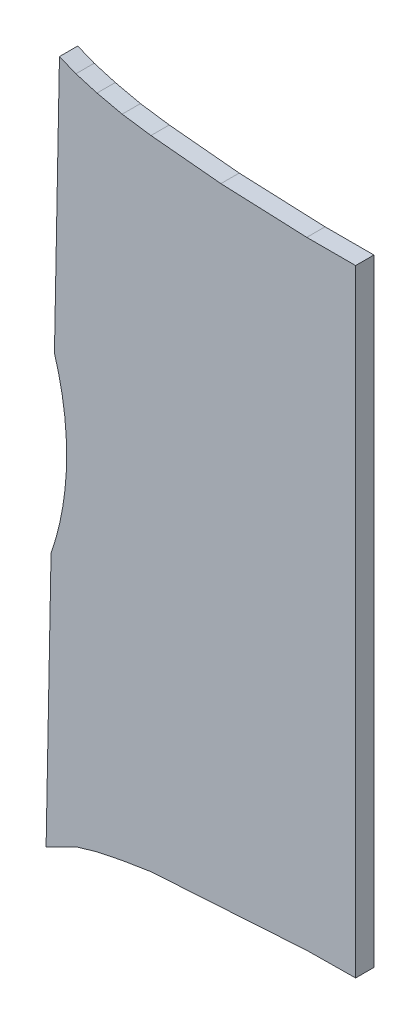
ISO-10303-21;
HEADER;
FILE_DESCRIPTION(('STEP AP214'),'2;1');
FILE_NAME('part.step','',(''),(''),'','','');
FILE_SCHEMA(('AUTOMOTIVE_DESIGN { 1 0 10303 214 1 1 1 1 }'));
ENDSEC;
DATA;
#1=APPLICATION_CONTEXT('core data for automotive mechanical design processes');
#2=APPLICATION_PROTOCOL_DEFINITION('international standard','automotive_design',2000,#1);
#3=PRODUCT_CONTEXT('',#1,'mechanical');
#4=PRODUCT('Part','Part','',(#3));
#5=PRODUCT_RELATED_PRODUCT_CATEGORY('part','',(#4));
#6=PRODUCT_DEFINITION_FORMATION('','',#4);
#7=PRODUCT_DEFINITION_CONTEXT('part definition',#1,'design');
#8=PRODUCT_DEFINITION('design','',#6,#7);
#9=PRODUCT_DEFINITION_SHAPE('','',#8);
#10=(LENGTH_UNIT() NAMED_UNIT(*) SI_UNIT(.MILLI.,.METRE.));
#11=(NAMED_UNIT(*) PLANE_ANGLE_UNIT() SI_UNIT($,.RADIAN.));
#12=(NAMED_UNIT(*) SI_UNIT($,.STERADIAN.) SOLID_ANGLE_UNIT());
#13=UNCERTAINTY_MEASURE_WITH_UNIT(LENGTH_MEASURE(1.E-05),#10,'distance_accuracy_value','');
#14=(GEOMETRIC_REPRESENTATION_CONTEXT(3) GLOBAL_UNCERTAINTY_ASSIGNED_CONTEXT((#13)) GLOBAL_UNIT_ASSIGNED_CONTEXT((#10,
#11,#12)) REPRESENTATION_CONTEXT('',''));
#15=CARTESIAN_POINT('',(0.,0.,0.));
#16=DIRECTION('',(0.,0.,1.));
#17=DIRECTION('',(1.,0.,0.));
#18=AXIS2_PLACEMENT_3D('',#15,#16,#17);
#19=CARTESIAN_POINT('',(80.0120010375977,56.6370010375977,0.));
#20=DIRECTION('',(-1.,0.,0.));
#21=DIRECTION('',(0.,1.,0.));
#22=AXIS2_PLACEMENT_3D('',#19,#20,#21);
#23=PLANE('',#22);
#24=DIRECTION('',(0.,1.,0.));
#25=VECTOR('',#24,1.);
#26=CARTESIAN_POINT('',(80.0120010375977,56.6370010375976,0.03556));
#27=LINE('',#26,#25);
#28=CARTESIAN_POINT('',(80.0120010375977,56.6370010375976,0.03556));
#29=VERTEX_POINT('',#28);
#30=CARTESIAN_POINT('',(80.0120010375977,57.8370018005371,0.03556));
#31=VERTEX_POINT('',#30);
#32=EDGE_CURVE('E11',#29,#31,#27,.T.);
#33=ORIENTED_EDGE('',*,*,#32,.F.);
#34=DIRECTION('',(0.,0.,1.));
#35=VECTOR('',#34,1.);
#36=CARTESIAN_POINT('',(80.0120010375977,56.6370010375976,0.));
#37=LINE('',#36,#35);
#38=CARTESIAN_POINT('',(80.0120010375977,56.6370010375976,0.));
#39=VERTEX_POINT('',#38);
#40=EDGE_CURVE('E24',#39,#29,#37,.T.);
#41=ORIENTED_EDGE('',*,*,#40,.F.);
#42=DIRECTION('',(0.,1.,0.));
#43=VECTOR('',#42,1.);
#44=CARTESIAN_POINT('',(80.0120010375977,56.6370010375976,0.));
#45=LINE('',#44,#43);
#46=CARTESIAN_POINT('',(80.0120010375977,57.8370018005371,0.));
#47=VERTEX_POINT('',#46);
#48=EDGE_CURVE('E281',#39,#47,#45,.T.);
#49=ORIENTED_EDGE('',*,*,#48,.T.);
#50=DIRECTION('',(0.,0.,1.));
#51=VECTOR('',#50,1.);
#52=CARTESIAN_POINT('',(80.0120010375977,57.8370018005371,0.));
#53=LINE('',#52,#51);
#54=EDGE_CURVE('E37',#47,#31,#53,.T.);
#55=ORIENTED_EDGE('',*,*,#54,.T.);
#56=EDGE_LOOP('',(#33,#41,#49,#55));
#57=FACE_BOUND('',#56,.T.);
#58=ADVANCED_FACE('F17',(#57),#23,.F.);
#59=CARTESIAN_POINT('',(79.9169998168945,56.6360015869141,0.));
#60=DIRECTION('',(-0.010519816185477,0.999944665202742,0.));
#61=DIRECTION('',(0.999944665202742,0.010519816185477,0.));
#62=AXIS2_PLACEMENT_3D('',#59,#60,#61);
#63=PLANE('',#62);
#64=DIRECTION('',(0.999944665202742,0.010519816185477,0.));
#65=VECTOR('',#64,1.);
#66=CARTESIAN_POINT('',(79.9169998168945,56.6360015869141,0.03556));
#67=LINE('',#66,#65);
#68=CARTESIAN_POINT('',(79.9169998168945,56.6360015869141,0.03556));
#69=VERTEX_POINT('',#68);
#70=EDGE_CURVE('E277',#69,#29,#67,.T.);
#71=ORIENTED_EDGE('',*,*,#70,.F.);
#72=DIRECTION('',(0.,0.,1.));
#73=VECTOR('',#72,1.);
#74=CARTESIAN_POINT('',(79.9169998168945,56.6360015869141,0.));
#75=LINE('',#74,#73);
#76=CARTESIAN_POINT('',(79.9169998168945,56.6360015869141,0.));
#77=VERTEX_POINT('',#76);
#78=EDGE_CURVE('E275',#77,#69,#75,.T.);
#79=ORIENTED_EDGE('',*,*,#78,.F.);
#80=DIRECTION('',(0.999944665202742,0.010519816185477,0.));
#81=VECTOR('',#80,1.);
#82=CARTESIAN_POINT('',(79.9169998168945,56.6360015869141,0.));
#83=LINE('',#82,#81);
#84=EDGE_CURVE('E273',#77,#39,#83,.T.);
#85=ORIENTED_EDGE('',*,*,#84,.T.);
#86=ORIENTED_EDGE('',*,*,#40,.T.);
#87=EDGE_LOOP('',(#71,#79,#85,#86));
#88=FACE_BOUND('',#87,.T.);
#89=ADVANCED_FACE('F284',(#88),#63,.F.);
#90=CARTESIAN_POINT('',(79.613998413086,56.617000579834,0.));
#91=DIRECTION('',(-0.0625863654447241,0.998039551751542,0.));
#92=DIRECTION('',(0.998039551751542,0.0625863654447241,0.));
#93=AXIS2_PLACEMENT_3D('',#90,#91,#92);
#94=PLANE('',#93);
#95=DIRECTION('',(0.998039551751542,0.062586365444724,0.));
#96=VECTOR('',#95,1.);
#97=CARTESIAN_POINT('',(79.6139984130859,56.617000579834,0.03556));
#98=LINE('',#97,#96);
#99=CARTESIAN_POINT('',(79.6139984130859,56.617000579834,0.03556));
#100=VERTEX_POINT('',#99);
#101=EDGE_CURVE('E270',#100,#69,#98,.T.);
#102=ORIENTED_EDGE('',*,*,#101,.F.);
#103=DIRECTION('',(0.,0.,1.));
#104=VECTOR('',#103,1.);
#105=CARTESIAN_POINT('',(79.6139984130859,56.617000579834,0.));
#106=LINE('',#105,#104);
#107=CARTESIAN_POINT('',(79.6139984130859,56.617000579834,0.));
#108=VERTEX_POINT('',#107);
#109=EDGE_CURVE('E268',#108,#100,#106,.T.);
#110=ORIENTED_EDGE('',*,*,#109,.F.);
#111=DIRECTION('',(0.998039551751542,0.062586365444724,0.));
#112=VECTOR('',#111,1.);
#113=CARTESIAN_POINT('',(79.6139984130859,56.617000579834,0.));
#114=LINE('',#113,#112);
#115=EDGE_CURVE('E265',#108,#77,#114,.T.);
#116=ORIENTED_EDGE('',*,*,#115,.T.);
#117=ORIENTED_EDGE('',*,*,#78,.T.);
#118=EDGE_LOOP('',(#102,#110,#116,#117));
#119=FACE_BOUND('',#118,.T.);
#120=ADVANCED_FACE('F287',(#119),#94,.F.);
#121=CARTESIAN_POINT('',(79.5579986572266,56.6080017089844,0.));
#122=DIRECTION('',(-0.158659362899509,0.98733338167223,0.));
#123=DIRECTION('',(0.98733338167223,0.158659362899509,0.));
#124=AXIS2_PLACEMENT_3D('',#121,#122,#123);
#125=PLANE('',#124);
#126=DIRECTION('',(0.98733338167223,0.158659362899509,0.));
#127=VECTOR('',#126,1.);
#128=CARTESIAN_POINT('',(79.5579986572266,56.6080017089844,0.03556));
#129=LINE('',#128,#127);
#130=CARTESIAN_POINT('',(79.5579986572266,56.6080017089844,0.03556));
#131=VERTEX_POINT('',#130);
#132=EDGE_CURVE('E262',#131,#100,#129,.T.);
#133=ORIENTED_EDGE('',*,*,#132,.F.);
#134=DIRECTION('',(0.,0.,1.));
#135=VECTOR('',#134,1.);
#136=CARTESIAN_POINT('',(79.5579986572266,56.6080017089844,0.));
#137=LINE('',#136,#135);
#138=CARTESIAN_POINT('',(79.5579986572266,56.6080017089844,0.));
#139=VERTEX_POINT('',#138);
#140=EDGE_CURVE('E260',#139,#131,#137,.T.);
#141=ORIENTED_EDGE('',*,*,#140,.F.);
#142=DIRECTION('',(0.98733338167223,0.158659362899509,0.));
#143=VECTOR('',#142,1.);
#144=CARTESIAN_POINT('',(79.5579986572266,56.6080017089844,0.));
#145=LINE('',#144,#143);
#146=EDGE_CURVE('E257',#139,#108,#145,.T.);
#147=ORIENTED_EDGE('',*,*,#146,.T.);
#148=ORIENTED_EDGE('',*,*,#109,.T.);
#149=EDGE_LOOP('',(#133,#141,#147,#148));
#150=FACE_BOUND('',#149,.T.);
#151=ADVANCED_FACE('F292',(#150),#125,.F.);
#152=CARTESIAN_POINT('',(79.5090026855469,56.5979995727539,0.));
#153=DIRECTION('',(-0.200016805310508,0.979792466593502,0.));
#154=DIRECTION('',(0.979792466593502,0.200016805310508,0.));
#155=AXIS2_PLACEMENT_3D('',#152,#153,#154);
#156=PLANE('',#155);
#157=DIRECTION('',(0.979792466593502,0.200016805310508,0.));
#158=VECTOR('',#157,1.);
#159=CARTESIAN_POINT('',(79.5090026855469,56.5979995727539,0.03556));
#160=LINE('',#159,#158);
#161=CARTESIAN_POINT('',(79.5090026855469,56.5979995727539,0.03556));
#162=VERTEX_POINT('',#161);
#163=EDGE_CURVE('E254',#162,#131,#160,.T.);
#164=ORIENTED_EDGE('',*,*,#163,.F.);
#165=DIRECTION('',(0.,0.,1.));
#166=VECTOR('',#165,1.);
#167=CARTESIAN_POINT('',(79.5090026855469,56.5979995727539,0.));
#168=LINE('',#167,#166);
#169=CARTESIAN_POINT('',(79.5090026855469,56.5979995727539,0.));
#170=VERTEX_POINT('',#169);
#171=EDGE_CURVE('E252',#170,#162,#168,.T.);
#172=ORIENTED_EDGE('',*,*,#171,.F.);
#173=DIRECTION('',(0.979792466593502,0.200016805310508,0.));
#174=VECTOR('',#173,1.);
#175=CARTESIAN_POINT('',(79.5090026855469,56.5979995727539,0.));
#176=LINE('',#175,#174);
#177=EDGE_CURVE('E249',#170,#139,#176,.T.);
#178=ORIENTED_EDGE('',*,*,#177,.T.);
#179=ORIENTED_EDGE('',*,*,#140,.T.);
#180=EDGE_LOOP('',(#164,#172,#178,#179));
#181=FACE_BOUND('',#180,.T.);
#182=ADVANCED_FACE('F295',(#181),#156,.F.);
#183=CARTESIAN_POINT('',(79.4680023193359,56.5859985351562,0.));
#184=DIRECTION('',(-0.280918813771343,0.959731535414619,0.));
#185=DIRECTION('',(0.959731535414619,0.280918813771343,0.));
#186=AXIS2_PLACEMENT_3D('',#183,#184,#185);
#187=PLANE('',#186);
#188=DIRECTION('',(0.959731535414619,0.280918813771343,0.));
#189=VECTOR('',#188,1.);
#190=CARTESIAN_POINT('',(79.4680023193359,56.5859985351562,0.03556));
#191=LINE('',#190,#189);
#192=CARTESIAN_POINT('',(79.4680023193359,56.5859985351562,0.03556));
#193=VERTEX_POINT('',#192);
#194=EDGE_CURVE('E246',#193,#162,#191,.T.);
#195=ORIENTED_EDGE('',*,*,#194,.F.);
#196=DIRECTION('',(0.,0.,1.));
#197=VECTOR('',#196,1.);
#198=CARTESIAN_POINT('',(79.4680023193359,56.5859985351562,0.));
#199=LINE('',#198,#197);
#200=CARTESIAN_POINT('',(79.4680023193359,56.5859985351562,0.));
#201=VERTEX_POINT('',#200);
#202=EDGE_CURVE('E244',#201,#193,#199,.T.);
#203=ORIENTED_EDGE('',*,*,#202,.F.);
#204=DIRECTION('',(0.959731535414619,0.280918813771343,0.));
#205=VECTOR('',#204,1.);
#206=CARTESIAN_POINT('',(79.4680023193359,56.5859985351562,0.));
#207=LINE('',#206,#205);
#208=EDGE_CURVE('E241',#201,#170,#207,.T.);
#209=ORIENTED_EDGE('',*,*,#208,.T.);
#210=ORIENTED_EDGE('',*,*,#171,.T.);
#211=EDGE_LOOP('',(#195,#203,#209,#210));
#212=FACE_BOUND('',#211,.T.);
#213=ADVANCED_FACE('F300',(#212),#187,.F.);
#214=CARTESIAN_POINT('',(79.4100036621094,56.556999206543,0.));
#215=DIRECTION('',(-0.447213595499958,0.894427190999916,0.));
#216=DIRECTION('',(0.894427190999916,0.447213595499958,0.));
#217=AXIS2_PLACEMENT_3D('',#214,#215,#216);
#218=PLANE('',#217);
#219=DIRECTION('',(0.894427190999916,0.447213595499958,0.));
#220=VECTOR('',#219,1.);
#221=CARTESIAN_POINT('',(79.4100036621094,56.556999206543,0.03556));
#222=LINE('',#221,#220);
#223=CARTESIAN_POINT('',(79.4100036621094,56.556999206543,0.03556));
#224=VERTEX_POINT('',#223);
#225=EDGE_CURVE('E238',#224,#193,#222,.T.);
#226=ORIENTED_EDGE('',*,*,#225,.F.);
#227=DIRECTION('',(0.,0.,1.));
#228=VECTOR('',#227,1.);
#229=CARTESIAN_POINT('',(79.4100036621094,56.556999206543,0.));
#230=LINE('',#229,#228);
#231=CARTESIAN_POINT('',(79.4100036621094,56.556999206543,0.));
#232=VERTEX_POINT('',#231);
#233=EDGE_CURVE('E236',#232,#224,#230,.T.);
#234=ORIENTED_EDGE('',*,*,#233,.F.);
#235=DIRECTION('',(0.894427190999916,0.447213595499958,0.));
#236=VECTOR('',#235,1.);
#237=CARTESIAN_POINT('',(79.4100036621094,56.556999206543,0.));
#238=LINE('',#237,#236);
#239=EDGE_CURVE('E233',#232,#201,#238,.T.);
#240=ORIENTED_EDGE('',*,*,#239,.T.);
#241=ORIENTED_EDGE('',*,*,#202,.T.);
#242=EDGE_LOOP('',(#226,#234,#240,#241));
#243=FACE_BOUND('',#242,.T.);
#244=ADVANCED_FACE('F303',(#243),#218,.F.);
#245=CARTESIAN_POINT('',(79.4196636040974,57.0564723619736,0.));
#246=DIRECTION('',(0.999813029571255,-0.0193366465434987,0.));
#247=DIRECTION('',(-0.0193366465434987,-0.999813029571255,0.));
#248=AXIS2_PLACEMENT_3D('',#245,#246,#247);
#249=PLANE('',#248);
#250=DIRECTION('',(-0.0193366465434987,-0.999813029571255,0.));
#251=VECTOR('',#250,1.);
#252=CARTESIAN_POINT('',(79.4359970092773,57.9010009765625,0.03556));
#253=LINE('',#252,#251);
#254=CARTESIAN_POINT('',(79.4196636040974,57.0564723619736,0.03556));
#255=VERTEX_POINT('',#254);
#256=EDGE_CURVE('E230',#255,#224,#253,.T.);
#257=ORIENTED_EDGE('',*,*,#256,.F.);
#258=DIRECTION('',(0.,0.,1.));
#259=VECTOR('',#258,1.);
#260=CARTESIAN_POINT('',(79.4196636040974,57.0564723619736,0.));
#261=LINE('',#260,#259);
#262=CARTESIAN_POINT('',(79.4196636040974,57.0564723619736,0.));
#263=VERTEX_POINT('',#262);
#264=EDGE_CURVE('E228',#263,#255,#261,.T.);
#265=ORIENTED_EDGE('',*,*,#264,.F.);
#266=DIRECTION('',(-0.0193366465434987,-0.999813029571255,0.));
#267=VECTOR('',#266,1.);
#268=CARTESIAN_POINT('',(79.4359970092773,57.9010009765625,0.));
#269=LINE('',#268,#267);
#270=EDGE_CURVE('E225',#263,#232,#269,.T.);
#271=ORIENTED_EDGE('',*,*,#270,.T.);
#272=ORIENTED_EDGE('',*,*,#233,.T.);
#273=EDGE_LOOP('',(#257,#265,#271,#272));
#274=FACE_BOUND('',#273,.T.);
#275=ADVANCED_FACE('F308',(#274),#249,.F.);
#276=CARTESIAN_POINT('',(78.90002,57.2366648,0.));
#277=DIRECTION('',(0.,0.,-1.));
#278=DIRECTION('',(1.,0.,0.));
#279=AXIS2_PLACEMENT_3D('',#276,#277,#278);
#280=CYLINDRICAL_SURFACE('',#279,0.5499989);
#281=ORIENTED_EDGE('',*,*,#264,.T.);
#282=CARTESIAN_POINT('',(78.90002,57.2366648,0.03556));
#283=DIRECTION('',(0.,0.,1.));
#284=DIRECTION('',(1.,0.,0.));
#285=AXIS2_PLACEMENT_3D('',#282,#283,#284);
#286=CIRCLE('',#285,0.5499989);
#287=CARTESIAN_POINT('',(79.4500189,57.2366648,0.03556));
#288=VERTEX_POINT('',#287);
#289=EDGE_CURVE('E222',#255,#288,#286,.T.);
#290=ORIENTED_EDGE('',*,*,#289,.T.);
#291=DIRECTION('',(0.,0.,1.));
#292=VECTOR('',#291,1.);
#293=CARTESIAN_POINT('',(79.4500189,57.2366648,0.));
#294=LINE('',#293,#292);
#295=CARTESIAN_POINT('',(79.4500189,57.2366648,0.));
#296=VERTEX_POINT('',#295);
#297=EDGE_CURVE('E220',#296,#288,#294,.T.);
#298=ORIENTED_EDGE('',*,*,#297,.F.);
#299=CARTESIAN_POINT('',(78.90002,57.2366648,0.));
#300=DIRECTION('',(0.,0.,1.));
#301=DIRECTION('',(1.,0.,0.));
#302=AXIS2_PLACEMENT_3D('',#299,#300,#301);
#303=CIRCLE('',#302,0.5499989);
#304=EDGE_CURVE('E217',#263,#296,#303,.T.);
#305=ORIENTED_EDGE('',*,*,#304,.F.);
#306=EDGE_LOOP('',(#281,#290,#298,#305));
#307=FACE_BOUND('',#306,.T.);
#308=ADVANCED_FACE('F311',(#307),#280,.F.);
#309=CARTESIAN_POINT('',(78.90002,57.2366648,0.));
#310=DIRECTION('',(0.,0.,-1.));
#311=DIRECTION('',(1.,0.,0.));
#312=AXIS2_PLACEMENT_3D('',#309,#310,#311);
#313=CYLINDRICAL_SURFACE('',#312,0.5499989);
#314=ORIENTED_EDGE('',*,*,#297,.T.);
#315=CARTESIAN_POINT('',(78.90002,57.2366648,0.03556));
#316=DIRECTION('',(0.,0.,1.));
#317=DIRECTION('',(1.,0.,0.));
#318=AXIS2_PLACEMENT_3D('',#315,#316,#317);
#319=CIRCLE('',#318,0.5499989);
#320=CARTESIAN_POINT('',(79.4262423405181,57.3966299160124,0.03556));
#321=VERTEX_POINT('',#320);
#322=EDGE_CURVE('E214',#288,#321,#319,.T.);
#323=ORIENTED_EDGE('',*,*,#322,.T.);
#324=DIRECTION('',(0.,0.,1.));
#325=VECTOR('',#324,1.);
#326=CARTESIAN_POINT('',(79.4262423405181,57.3966299160124,0.));
#327=LINE('',#326,#325);
#328=CARTESIAN_POINT('',(79.4262423405181,57.3966299160124,0.));
#329=VERTEX_POINT('',#328);
#330=EDGE_CURVE('E212',#329,#321,#327,.T.);
#331=ORIENTED_EDGE('',*,*,#330,.F.);
#332=EDGE_CURVE('E211',#296,#329,#303,.T.);
#333=ORIENTED_EDGE('',*,*,#332,.F.);
#334=EDGE_LOOP('',(#314,#323,#331,#333));
#335=FACE_BOUND('',#334,.T.);
#336=ADVANCED_FACE('F318',(#335),#313,.F.);
#337=CARTESIAN_POINT('',(79.4359970092774,57.9010009765625,0.));
#338=DIRECTION('',(0.999813029571255,-0.0193366465434987,0.));
#339=DIRECTION('',(-0.0193366465434987,-0.999813029571255,0.));
#340=AXIS2_PLACEMENT_3D('',#337,#338,#339);
#341=PLANE('',#340);
#342=DIRECTION('',(-0.0193366465434987,-0.999813029571255,0.));
#343=VECTOR('',#342,1.);
#344=CARTESIAN_POINT('',(79.4359970092773,57.9010009765625,0.03556));
#345=LINE('',#344,#343);
#346=CARTESIAN_POINT('',(79.4359970092773,57.9010009765625,0.03556));
#347=VERTEX_POINT('',#346);
#348=EDGE_CURVE('E208',#347,#321,#345,.T.);
#349=ORIENTED_EDGE('',*,*,#348,.F.);
#350=DIRECTION('',(0.,0.,1.));
#351=VECTOR('',#350,1.);
#352=CARTESIAN_POINT('',(79.4359970092773,57.9010009765625,0.));
#353=LINE('',#352,#351);
#354=CARTESIAN_POINT('',(79.4359970092773,57.9010009765625,0.));
#355=VERTEX_POINT('',#354);
#356=EDGE_CURVE('E206',#355,#347,#353,.T.);
#357=ORIENTED_EDGE('',*,*,#356,.F.);
#358=EDGE_CURVE('E205',#355,#329,#269,.T.);
#359=ORIENTED_EDGE('',*,*,#358,.T.);
#360=ORIENTED_EDGE('',*,*,#330,.T.);
#361=EDGE_LOOP('',(#349,#357,#359,#360));
#362=FACE_BOUND('',#361,.T.);
#363=ADVANCED_FACE('F321',(#362),#341,.F.);
#364=CARTESIAN_POINT('',(79.4680023193359,57.8880004882812,0.));
#365=DIRECTION('',(-0.376335578562442,-0.926483422575964,0.));
#366=DIRECTION('',(-0.926483422575964,0.376335578562442,0.));
#367=AXIS2_PLACEMENT_3D('',#364,#365,#366);
#368=PLANE('',#367);
#369=DIRECTION('',(-0.926483422575964,0.376335578562442,0.));
#370=VECTOR('',#369,1.);
#371=CARTESIAN_POINT('',(79.4680023193359,57.8880004882812,0.03556));
#372=LINE('',#371,#370);
#373=CARTESIAN_POINT('',(79.4680023193359,57.8880004882812,0.03556));
#374=VERTEX_POINT('',#373);
#375=EDGE_CURVE('E202',#374,#347,#372,.T.);
#376=ORIENTED_EDGE('',*,*,#375,.F.);
#377=DIRECTION('',(0.,0.,1.));
#378=VECTOR('',#377,1.);
#379=CARTESIAN_POINT('',(79.4680023193359,57.8880004882812,0.));
#380=LINE('',#379,#378);
#381=CARTESIAN_POINT('',(79.4680023193359,57.8880004882812,0.));
#382=VERTEX_POINT('',#381);
#383=EDGE_CURVE('E200',#382,#374,#380,.T.);
#384=ORIENTED_EDGE('',*,*,#383,.F.);
#385=DIRECTION('',(-0.926483422575964,0.376335578562442,0.));
#386=VECTOR('',#385,1.);
#387=CARTESIAN_POINT('',(79.4680023193359,57.8880004882812,0.));
#388=LINE('',#387,#386);
#389=EDGE_CURVE('E197',#382,#355,#388,.T.);
#390=ORIENTED_EDGE('',*,*,#389,.T.);
#391=ORIENTED_EDGE('',*,*,#356,.T.);
#392=EDGE_LOOP('',(#376,#384,#390,#391));
#393=FACE_BOUND('',#392,.T.);
#394=ADVANCED_FACE('F326',(#393),#368,.F.);
#395=CARTESIAN_POINT('',(79.5090026855469,57.8759994506836,0.));
#396=DIRECTION('',(-0.280918813771343,-0.959731535414619,0.));
#397=DIRECTION('',(-0.959731535414619,0.280918813771343,0.));
#398=AXIS2_PLACEMENT_3D('',#395,#396,#397);
#399=PLANE('',#398);
#400=DIRECTION('',(-0.959731535414619,0.280918813771343,0.));
#401=VECTOR('',#400,1.);
#402=CARTESIAN_POINT('',(79.5090026855469,57.8759994506836,0.03556));
#403=LINE('',#402,#401);
#404=CARTESIAN_POINT('',(79.5090026855469,57.8759994506836,0.03556));
#405=VERTEX_POINT('',#404);
#406=EDGE_CURVE('E194',#405,#374,#403,.T.);
#407=ORIENTED_EDGE('',*,*,#406,.F.);
#408=DIRECTION('',(0.,0.,1.));
#409=VECTOR('',#408,1.);
#410=CARTESIAN_POINT('',(79.5090026855469,57.8759994506836,0.));
#411=LINE('',#410,#409);
#412=CARTESIAN_POINT('',(79.5090026855469,57.8759994506836,0.));
#413=VERTEX_POINT('',#412);
#414=EDGE_CURVE('E192',#413,#405,#411,.T.);
#415=ORIENTED_EDGE('',*,*,#414,.F.);
#416=DIRECTION('',(-0.959731535414619,0.280918813771343,0.));
#417=VECTOR('',#416,1.);
#418=CARTESIAN_POINT('',(79.5090026855469,57.8759994506836,0.));
#419=LINE('',#418,#417);
#420=EDGE_CURVE('E189',#413,#382,#419,.T.);
#421=ORIENTED_EDGE('',*,*,#420,.T.);
#422=ORIENTED_EDGE('',*,*,#383,.T.);
#423=EDGE_LOOP('',(#407,#415,#421,#422));
#424=FACE_BOUND('',#423,.T.);
#425=ADVANCED_FACE('F329',(#424),#399,.F.);
#426=CARTESIAN_POINT('',(79.5579986572266,57.8650016784668,0.));
#427=DIRECTION('',(-0.219013250789558,-0.975721884544254,0.));
#428=DIRECTION('',(-0.975721884544254,0.219013250789558,0.));
#429=AXIS2_PLACEMENT_3D('',#426,#427,#428);
#430=PLANE('',#429);
#431=DIRECTION('',(-0.975721884544254,0.219013250789558,0.));
#432=VECTOR('',#431,1.);
#433=CARTESIAN_POINT('',(79.5579986572266,57.8650016784668,0.03556));
#434=LINE('',#433,#432);
#435=CARTESIAN_POINT('',(79.5579986572266,57.8650016784668,0.03556));
#436=VERTEX_POINT('',#435);
#437=EDGE_CURVE('E186',#436,#405,#434,.T.);
#438=ORIENTED_EDGE('',*,*,#437,.F.);
#439=DIRECTION('',(0.,0.,1.));
#440=VECTOR('',#439,1.);
#441=CARTESIAN_POINT('',(79.5579986572266,57.8650016784668,0.));
#442=LINE('',#441,#440);
#443=CARTESIAN_POINT('',(79.5579986572266,57.8650016784668,0.));
#444=VERTEX_POINT('',#443);
#445=EDGE_CURVE('E184',#444,#436,#442,.T.);
#446=ORIENTED_EDGE('',*,*,#445,.F.);
#447=DIRECTION('',(-0.975721884544254,0.219013250789558,0.));
#448=VECTOR('',#447,1.);
#449=CARTESIAN_POINT('',(79.5579986572266,57.8650016784668,0.));
#450=LINE('',#449,#448);
#451=EDGE_CURVE('E181',#444,#413,#450,.T.);
#452=ORIENTED_EDGE('',*,*,#451,.T.);
#453=ORIENTED_EDGE('',*,*,#414,.T.);
#454=EDGE_LOOP('',(#438,#446,#452,#453));
#455=FACE_BOUND('',#454,.T.);
#456=ADVANCED_FACE('F333',(#455),#430,.F.);
#457=CARTESIAN_POINT('',(79.613998413086,57.8569984436035,0.));
#458=DIRECTION('',(-0.141478001154013,-0.98994139987651,0.));
#459=DIRECTION('',(-0.98994139987651,0.141478001154013,0.));
#460=AXIS2_PLACEMENT_3D('',#457,#458,#459);
#461=PLANE('',#460);
#462=DIRECTION('',(-0.98994139987651,0.141478001154013,0.));
#463=VECTOR('',#462,1.);
#464=CARTESIAN_POINT('',(79.6139984130859,57.8569984436035,0.03556));
#465=LINE('',#464,#463);
#466=CARTESIAN_POINT('',(79.6139984130859,57.8569984436035,0.03556));
#467=VERTEX_POINT('',#466);
#468=EDGE_CURVE('E178',#467,#436,#465,.T.);
#469=ORIENTED_EDGE('',*,*,#468,.F.);
#470=DIRECTION('',(0.,0.,1.));
#471=VECTOR('',#470,1.);
#472=CARTESIAN_POINT('',(79.6139984130859,57.8569984436035,0.));
#473=LINE('',#472,#471);
#474=CARTESIAN_POINT('',(79.6139984130859,57.8569984436035,0.));
#475=VERTEX_POINT('',#474);
#476=EDGE_CURVE('E176',#475,#467,#473,.T.);
#477=ORIENTED_EDGE('',*,*,#476,.F.);
#478=DIRECTION('',(-0.98994139987651,0.141478001154013,0.));
#479=VECTOR('',#478,1.);
#480=CARTESIAN_POINT('',(79.6139984130859,57.8569984436035,0.));
#481=LINE('',#480,#479);
#482=EDGE_CURVE('E173',#475,#444,#481,.T.);
#483=ORIENTED_EDGE('',*,*,#482,.T.);
#484=ORIENTED_EDGE('',*,*,#445,.T.);
#485=EDGE_LOOP('',(#469,#477,#483,#484));
#486=FACE_BOUND('',#485,.T.);
#487=ADVANCED_FACE('F336',(#486),#461,.F.);
#488=CARTESIAN_POINT('',(79.75,57.8440017700195,0.));
#489=DIRECTION('',(-0.095129277619608,-0.995464926825437,0.));
#490=DIRECTION('',(-0.995464926825437,0.095129277619608,0.));
#491=AXIS2_PLACEMENT_3D('',#488,#489,#490);
#492=PLANE('',#491);
#493=DIRECTION('',(-0.995464926825436,0.0951292776196079,0.));
#494=VECTOR('',#493,1.);
#495=CARTESIAN_POINT('',(79.75,57.8440017700195,0.03556));
#496=LINE('',#495,#494);
#497=CARTESIAN_POINT('',(79.75,57.8440017700195,0.03556));
#498=VERTEX_POINT('',#497);
#499=EDGE_CURVE('E170',#498,#467,#496,.T.);
#500=ORIENTED_EDGE('',*,*,#499,.F.);
#501=DIRECTION('',(0.,0.,1.));
#502=VECTOR('',#501,1.);
#503=CARTESIAN_POINT('',(79.75,57.8440017700195,0.));
#504=LINE('',#503,#502);
#505=CARTESIAN_POINT('',(79.75,57.8440017700195,0.));
#506=VERTEX_POINT('',#505);
#507=EDGE_CURVE('E168',#506,#498,#504,.T.);
#508=ORIENTED_EDGE('',*,*,#507,.F.);
#509=DIRECTION('',(-0.995464926825436,0.0951292776196079,0.));
#510=VECTOR('',#509,1.);
#511=CARTESIAN_POINT('',(79.75,57.8440017700195,0.));
#512=LINE('',#511,#510);
#513=EDGE_CURVE('E159',#506,#475,#512,.T.);
#514=ORIENTED_EDGE('',*,*,#513,.T.);
#515=ORIENTED_EDGE('',*,*,#476,.T.);
#516=EDGE_LOOP('',(#500,#508,#514,#515));
#517=FACE_BOUND('',#516,.T.);
#518=ADVANCED_FACE('F339',(#517),#492,.F.);
#519=CARTESIAN_POINT('',(79.9169998168945,57.8370018005371,0.));
#520=DIRECTION('',(-0.0418792570717929,-0.999122679067548,0.));
#521=DIRECTION('',(-0.999122679067548,0.0418792570717929,0.));
#522=AXIS2_PLACEMENT_3D('',#519,#520,#521);
#523=PLANE('',#522);
#524=DIRECTION('',(-0.999122679067548,0.0418792570717929,0.));
#525=VECTOR('',#524,1.);
#526=CARTESIAN_POINT('',(79.9169998168945,57.8370018005371,0.03556));
#527=LINE('',#526,#525);
#528=CARTESIAN_POINT('',(79.9169998168945,57.8370018005371,0.03556));
#529=VERTEX_POINT('',#528);
#530=EDGE_CURVE('E145',#529,#498,#527,.T.);
#531=ORIENTED_EDGE('',*,*,#530,.F.);
#532=DIRECTION('',(0.,0.,1.));
#533=VECTOR('',#532,1.);
#534=CARTESIAN_POINT('',(79.9169998168945,57.8370018005371,0.));
#535=LINE('',#534,#533);
#536=CARTESIAN_POINT('',(79.9169998168945,57.8370018005371,0.));
#537=VERTEX_POINT('',#536);
#538=EDGE_CURVE('E140',#537,#529,#535,.T.);
#539=ORIENTED_EDGE('',*,*,#538,.F.);
#540=DIRECTION('',(-0.999122679067548,0.0418792570717929,0.));
#541=VECTOR('',#540,1.);
#542=CARTESIAN_POINT('',(79.9169998168945,57.8370018005371,0.));
#543=LINE('',#542,#541);
#544=EDGE_CURVE('E143',#537,#506,#543,.T.);
#545=ORIENTED_EDGE('',*,*,#544,.T.);
#546=ORIENTED_EDGE('',*,*,#507,.T.);
#547=EDGE_LOOP('',(#531,#539,#545,#546));
#548=FACE_BOUND('',#547,.T.);
#549=ADVANCED_FACE('F142',(#548),#523,.F.);
#550=CARTESIAN_POINT('',(80.0120010375977,57.8370018005371,0.));
#551=DIRECTION('',(0.,-1.,0.));
#552=DIRECTION('',(-1.,0.,0.));
#553=AXIS2_PLACEMENT_3D('',#550,#551,#552);
#554=PLANE('',#553);
#555=DIRECTION('',(-1.,0.,0.));
#556=VECTOR('',#555,1.);
#557=CARTESIAN_POINT('',(80.0120010375977,57.8370018005371,0.03556));
#558=LINE('',#557,#556);
#559=EDGE_CURVE('E160',#31,#529,#558,.T.);
#560=ORIENTED_EDGE('',*,*,#559,.F.);
#561=ORIENTED_EDGE('',*,*,#54,.F.);
#562=DIRECTION('',(-1.,0.,0.));
#563=VECTOR('',#562,1.);
#564=CARTESIAN_POINT('',(80.0120010375977,57.8370018005371,0.));
#565=LINE('',#564,#563);
#566=EDGE_CURVE('E156',#47,#537,#565,.T.);
#567=ORIENTED_EDGE('',*,*,#566,.T.);
#568=ORIENTED_EDGE('',*,*,#538,.T.);
#569=EDGE_LOOP('',(#560,#561,#567,#568));
#570=FACE_BOUND('',#569,.T.);
#571=ADVANCED_FACE('F162',(#570),#554,.F.);
#572=CARTESIAN_POINT('',(80.0120010375977,57.8370018005371,0.));
#573=DIRECTION('',(0.,0.,1.));
#574=DIRECTION('',(1.,0.,0.));
#575=AXIS2_PLACEMENT_3D('',#572,#573,#574);
#576=PLANE('',#575);
#577=ORIENTED_EDGE('',*,*,#566,.F.);
#578=ORIENTED_EDGE('',*,*,#48,.F.);
#579=ORIENTED_EDGE('',*,*,#84,.F.);
#580=ORIENTED_EDGE('',*,*,#115,.F.);
#581=ORIENTED_EDGE('',*,*,#146,.F.);
#582=ORIENTED_EDGE('',*,*,#177,.F.);
#583=ORIENTED_EDGE('',*,*,#208,.F.);
#584=ORIENTED_EDGE('',*,*,#239,.F.);
#585=ORIENTED_EDGE('',*,*,#270,.F.);
#586=ORIENTED_EDGE('',*,*,#304,.T.);
#587=ORIENTED_EDGE('',*,*,#332,.T.);
#588=ORIENTED_EDGE('',*,*,#358,.F.);
#589=ORIENTED_EDGE('',*,*,#389,.F.);
#590=ORIENTED_EDGE('',*,*,#420,.F.);
#591=ORIENTED_EDGE('',*,*,#451,.F.);
#592=ORIENTED_EDGE('',*,*,#482,.F.);
#593=ORIENTED_EDGE('',*,*,#513,.F.);
#594=ORIENTED_EDGE('',*,*,#544,.F.);
#595=EDGE_LOOP('',(#577,#578,#579,#580,#581,#582,#583,#584,#585,#586,#587,#588,#589,#590,#591,
#592,#593,#594));
#596=FACE_BOUND('',#595,.T.);
#597=ADVANCED_FACE('F154',(#596),#576,.F.);
#598=CARTESIAN_POINT('',(80.0120010375977,57.8370018005371,0.03556));
#599=DIRECTION('',(0.,0.,1.));
#600=DIRECTION('',(1.,0.,0.));
#601=AXIS2_PLACEMENT_3D('',#598,#599,#600);
#602=PLANE('',#601);
#603=ORIENTED_EDGE('',*,*,#32,.T.);
#604=ORIENTED_EDGE('',*,*,#559,.T.);
#605=ORIENTED_EDGE('',*,*,#530,.T.);
#606=ORIENTED_EDGE('',*,*,#499,.T.);
#607=ORIENTED_EDGE('',*,*,#468,.T.);
#608=ORIENTED_EDGE('',*,*,#437,.T.);
#609=ORIENTED_EDGE('',*,*,#406,.T.);
#610=ORIENTED_EDGE('',*,*,#375,.T.);
#611=ORIENTED_EDGE('',*,*,#348,.T.);
#612=ORIENTED_EDGE('',*,*,#322,.F.);
#613=ORIENTED_EDGE('',*,*,#289,.F.);
#614=ORIENTED_EDGE('',*,*,#256,.T.);
#615=ORIENTED_EDGE('',*,*,#225,.T.);
#616=ORIENTED_EDGE('',*,*,#194,.T.);
#617=ORIENTED_EDGE('',*,*,#163,.T.);
#618=ORIENTED_EDGE('',*,*,#132,.T.);
#619=ORIENTED_EDGE('',*,*,#101,.T.);
#620=ORIENTED_EDGE('',*,*,#70,.T.);
#621=EDGE_LOOP('',(#603,#604,#605,#606,#607,#608,#609,#610,#611,#612,#613,#614,#615,#616,#617,
#618,#619,#620));
#622=FACE_BOUND('',#621,.T.);
#623=ADVANCED_FACE('F341',(#622),#602,.T.);
#624=CLOSED_SHELL('',(#58,#89,#120,#151,#182,#213,#244,#275,#308,#336,#363,#394,#425,#456,#487,
#518,#549,#571,#597,#623));
#625=MANIFOLD_SOLID_BREP('B1',#624);
#626=ADVANCED_BREP_SHAPE_REPRESENTATION('',(#18,#625),#14);
#627=SHAPE_DEFINITION_REPRESENTATION(#9,#626);
ENDSEC;
END-ISO-10303-21;
